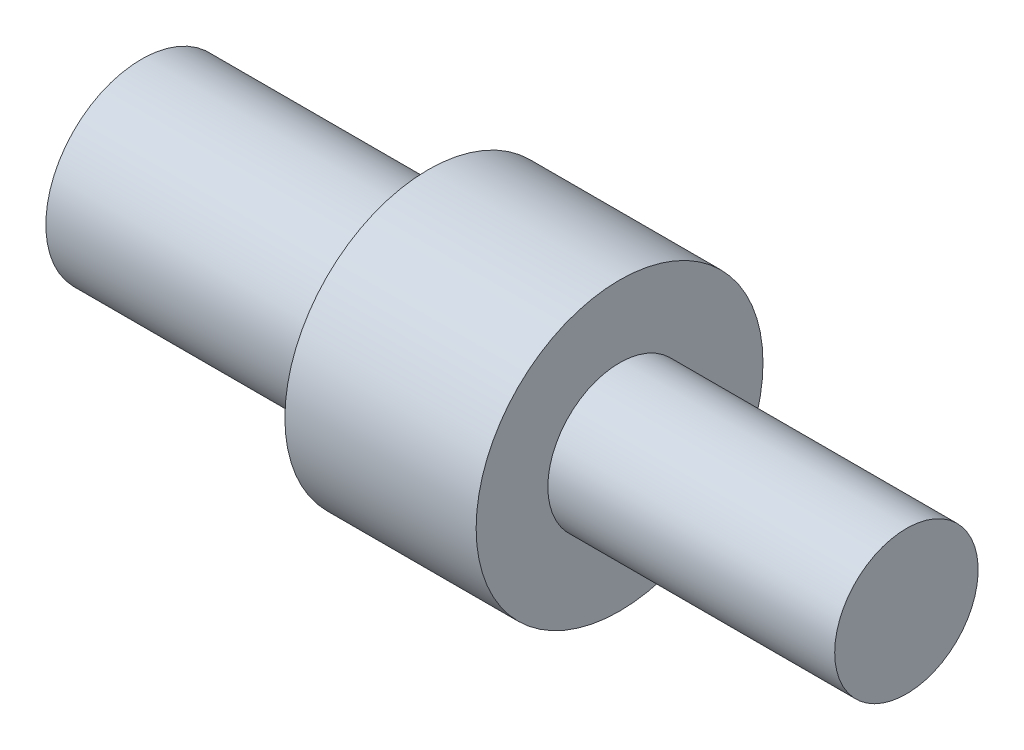
ISO-10303-21;
HEADER;
FILE_DESCRIPTION(('STEP AP214'),'2;1');
FILE_NAME('part.step','',(''),(''),'','','');
FILE_SCHEMA(('AUTOMOTIVE_DESIGN { 1 0 10303 214 1 1 1 1 }'));
ENDSEC;
DATA;
#1=APPLICATION_CONTEXT('core data for automotive mechanical design processes');
#2=APPLICATION_PROTOCOL_DEFINITION('international standard','automotive_design',2000,#1);
#3=PRODUCT_CONTEXT('',#1,'mechanical');
#4=PRODUCT('Part','Part','',(#3));
#5=PRODUCT_RELATED_PRODUCT_CATEGORY('part','',(#4));
#6=PRODUCT_DEFINITION_FORMATION('','',#4);
#7=PRODUCT_DEFINITION_CONTEXT('part definition',#1,'design');
#8=PRODUCT_DEFINITION('design','',#6,#7);
#9=PRODUCT_DEFINITION_SHAPE('','',#8);
#10=(LENGTH_UNIT() NAMED_UNIT(*) SI_UNIT(.MILLI.,.METRE.));
#11=(NAMED_UNIT(*) PLANE_ANGLE_UNIT() SI_UNIT($,.RADIAN.));
#12=(NAMED_UNIT(*) SI_UNIT($,.STERADIAN.) SOLID_ANGLE_UNIT());
#13=UNCERTAINTY_MEASURE_WITH_UNIT(LENGTH_MEASURE(1.E-05),#10,'distance_accuracy_value','');
#14=(GEOMETRIC_REPRESENTATION_CONTEXT(3) GLOBAL_UNCERTAINTY_ASSIGNED_CONTEXT((#13)) GLOBAL_UNIT_ASSIGNED_CONTEXT((#10,
#11,#12)) REPRESENTATION_CONTEXT('',''));
#15=CARTESIAN_POINT('',(0.,0.,0.));
#16=DIRECTION('',(0.,0.,1.));
#17=DIRECTION('',(1.,0.,0.));
#18=AXIS2_PLACEMENT_3D('',#15,#16,#17);
#19=CARTESIAN_POINT('',(-6.35,0.,0.));
#20=DIRECTION('',(1.,0.,0.));
#21=DIRECTION('',(0.,0.,-1.));
#22=AXIS2_PLACEMENT_3D('',#19,#20,#21);
#23=PLANE('',#22);
#24=CARTESIAN_POINT('',(-6.35,0.,0.));
#25=DIRECTION('',(1.,0.,0.));
#26=DIRECTION('',(0.,0.,-1.));
#27=AXIS2_PLACEMENT_3D('',#24,#25,#26);
#28=CIRCLE('',#27,9.525);
#29=CARTESIAN_POINT('',(-6.35,0.,-9.525));
#30=VERTEX_POINT('',#29);
#31=EDGE_CURVE('E40',#30,#30,#28,.T.);
#32=ORIENTED_EDGE('',*,*,#31,.F.);
#33=EDGE_LOOP('',(#32));
#34=FACE_BOUND('',#33,.T.);
#35=CARTESIAN_POINT('',(-6.35,0.,0.));
#36=DIRECTION('',(1.,0.,0.));
#37=DIRECTION('',(0.,0.,-1.));
#38=AXIS2_PLACEMENT_3D('',#35,#36,#37);
#39=CIRCLE('',#38,6.35);
#40=CARTESIAN_POINT('',(-6.35,0.,-6.35));
#41=VERTEX_POINT('',#40);
#42=EDGE_CURVE('E10',#41,#41,#39,.F.);
#43=ORIENTED_EDGE('',*,*,#42,.F.);
#44=EDGE_LOOP('',(#43));
#45=FACE_BOUND('',#44,.T.);
#46=ADVANCED_FACE('F29',(#34,#45),#23,.F.);
#47=CARTESIAN_POINT('',(6.35,0.,0.));
#48=DIRECTION('',(1.,0.,0.));
#49=DIRECTION('',(0.,0.,-1.));
#50=AXIS2_PLACEMENT_3D('',#47,#48,#49);
#51=PLANE('',#50);
#52=CARTESIAN_POINT('',(6.35,0.,0.));
#53=DIRECTION('',(1.,0.,0.));
#54=DIRECTION('',(0.,0.,-1.));
#55=AXIS2_PLACEMENT_3D('',#52,#53,#54);
#56=CIRCLE('',#55,9.525);
#57=CARTESIAN_POINT('',(6.35,0.,-9.525));
#58=VERTEX_POINT('',#57);
#59=EDGE_CURVE('E36',#58,#58,#56,.T.);
#60=ORIENTED_EDGE('',*,*,#59,.T.);
#61=EDGE_LOOP('',(#60));
#62=FACE_BOUND('',#61,.T.);
#63=CARTESIAN_POINT('',(6.35,0.,0.));
#64=DIRECTION('',(1.,0.,0.));
#65=DIRECTION('',(0.,0.,-1.));
#66=AXIS2_PLACEMENT_3D('',#63,#64,#65);
#67=CIRCLE('',#66,4.7625);
#68=CARTESIAN_POINT('',(6.35,0.,4.7625));
#69=VERTEX_POINT('',#68);
#70=EDGE_CURVE('E47',#69,#69,#67,.T.);
#71=ORIENTED_EDGE('',*,*,#70,.F.);
#72=EDGE_LOOP('',(#71));
#73=FACE_BOUND('',#72,.T.);
#74=ADVANCED_FACE('F71',(#62,#73),#51,.T.);
#75=CARTESIAN_POINT('',(6.35,0.,0.));
#76=DIRECTION('',(-1.,0.,0.));
#77=DIRECTION('',(0.,0.,1.));
#78=AXIS2_PLACEMENT_3D('',#75,#76,#77);
#79=CYLINDRICAL_SURFACE('',#78,9.525);
#80=ORIENTED_EDGE('',*,*,#59,.F.);
#81=EDGE_LOOP('',(#80));
#82=FACE_BOUND('',#81,.T.);
#83=ORIENTED_EDGE('',*,*,#31,.T.);
#84=EDGE_LOOP('',(#83));
#85=FACE_BOUND('',#84,.T.);
#86=ADVANCED_FACE('F31',(#82,#85),#79,.T.);
#87=CARTESIAN_POINT('',(25.4,0.,0.));
#88=DIRECTION('',(-1.,0.,0.));
#89=DIRECTION('',(0.,0.,1.));
#90=AXIS2_PLACEMENT_3D('',#87,#88,#89);
#91=CYLINDRICAL_SURFACE('',#90,4.7625);
#92=CARTESIAN_POINT('',(25.4,0.,0.));
#93=DIRECTION('',(1.,0.,0.));
#94=DIRECTION('',(0.,0.,-1.));
#95=AXIS2_PLACEMENT_3D('',#92,#93,#94);
#96=CIRCLE('',#95,4.7625);
#97=CARTESIAN_POINT('',(25.4,0.,4.7625));
#98=VERTEX_POINT('',#97);
#99=EDGE_CURVE('E45',#98,#98,#96,.T.);
#100=CARTESIAN_POINT('',(25.4,0.,4.7625));
#101=CARTESIAN_POINT('',(25.2015625,0.,4.7625));
#102=CARTESIAN_POINT('',(25.003125,0.,4.7625));
#103=CARTESIAN_POINT('',(24.60625,0.,4.7625));
#104=CARTESIAN_POINT('',(24.4078125,0.,4.7625));
#105=CARTESIAN_POINT('',(24.0109375,0.,4.7625));
#106=CARTESIAN_POINT('',(23.8125,0.,4.7625));
#107=CARTESIAN_POINT('',(23.415625,0.,4.7625));
#108=CARTESIAN_POINT('',(23.2171875,0.,4.7625));
#109=CARTESIAN_POINT('',(22.8203125,0.,4.7625));
#110=CARTESIAN_POINT('',(22.621875,0.,4.7625));
#111=CARTESIAN_POINT('',(22.225,0.,4.7625));
#112=CARTESIAN_POINT('',(22.0265625,0.,4.7625));
#113=CARTESIAN_POINT('',(21.6296875,0.,4.7625));
#114=CARTESIAN_POINT('',(21.43125,0.,4.7625));
#115=CARTESIAN_POINT('',(21.034375,0.,4.7625));
#116=CARTESIAN_POINT('',(20.8359375,0.,4.7625));
#117=CARTESIAN_POINT('',(20.4390625,0.,4.7625));
#118=CARTESIAN_POINT('',(20.240625,0.,4.7625));
#119=CARTESIAN_POINT('',(19.84375,0.,4.7625));
#120=CARTESIAN_POINT('',(19.6453125,0.,4.7625));
#121=CARTESIAN_POINT('',(19.2484375,0.,4.7625));
#122=CARTESIAN_POINT('',(19.05,0.,4.7625));
#123=CARTESIAN_POINT('',(18.653125,0.,4.7625));
#124=CARTESIAN_POINT('',(18.4546875,0.,4.7625));
#125=CARTESIAN_POINT('',(18.0578125,0.,4.7625));
#126=CARTESIAN_POINT('',(17.859375,0.,4.7625));
#127=CARTESIAN_POINT('',(17.4625,0.,4.7625));
#128=CARTESIAN_POINT('',(17.2640625,0.,4.7625));
#129=CARTESIAN_POINT('',(16.8671875,0.,4.7625));
#130=CARTESIAN_POINT('',(16.66875,0.,4.7625));
#131=CARTESIAN_POINT('',(16.271875,0.,4.7625));
#132=CARTESIAN_POINT('',(16.0734375,0.,4.7625));
#133=CARTESIAN_POINT('',(15.6765625,0.,4.7625));
#134=CARTESIAN_POINT('',(15.478125,0.,4.7625));
#135=CARTESIAN_POINT('',(15.08125,0.,4.7625));
#136=CARTESIAN_POINT('',(14.8828125,0.,4.7625));
#137=CARTESIAN_POINT('',(14.4859375,0.,4.7625));
#138=CARTESIAN_POINT('',(14.2875,0.,4.7625));
#139=CARTESIAN_POINT('',(13.890625,0.,4.7625));
#140=CARTESIAN_POINT('',(13.6921875,0.,4.7625));
#141=CARTESIAN_POINT('',(13.2953125,0.,4.7625));
#142=CARTESIAN_POINT('',(13.096875,0.,4.7625));
#143=CARTESIAN_POINT('',(12.7,0.,4.7625));
#144=CARTESIAN_POINT('',(12.5015625,0.,4.7625));
#145=CARTESIAN_POINT('',(12.1046875,0.,4.7625));
#146=CARTESIAN_POINT('',(11.90625,0.,4.7625));
#147=CARTESIAN_POINT('',(11.509375,0.,4.7625));
#148=CARTESIAN_POINT('',(11.3109375,0.,4.7625));
#149=CARTESIAN_POINT('',(10.9140625,0.,4.7625));
#150=CARTESIAN_POINT('',(10.715625,0.,4.7625));
#151=CARTESIAN_POINT('',(10.31875,0.,4.7625));
#152=CARTESIAN_POINT('',(10.1203125,0.,4.7625));
#153=CARTESIAN_POINT('',(9.7234375,0.,4.7625));
#154=CARTESIAN_POINT('',(9.525,0.,4.7625));
#155=CARTESIAN_POINT('',(9.128125,0.,4.7625));
#156=CARTESIAN_POINT('',(8.9296875,0.,4.7625));
#157=CARTESIAN_POINT('',(8.5328125,0.,4.7625));
#158=CARTESIAN_POINT('',(8.334375,0.,4.7625));
#159=CARTESIAN_POINT('',(7.9375,0.,4.7625));
#160=CARTESIAN_POINT('',(7.7390625,0.,4.7625));
#161=CARTESIAN_POINT('',(7.3421875,0.,4.7625));
#162=CARTESIAN_POINT('',(7.14375,0.,4.7625));
#163=CARTESIAN_POINT('',(6.746875,0.,4.7625));
#164=CARTESIAN_POINT('',(6.5484375,0.,4.7625));
#165=CARTESIAN_POINT('',(6.35,0.,4.7625));
#166=B_SPLINE_CURVE_WITH_KNOTS('',3,(#100,#101,#102,#103,#104,#105,#106,#107,#108,#109,#110,
#111,#112,#113,#114,#115,#116,#117,#118,#119,#120,#121,#122,#123,#124,#125,#126,#127,#128,#129,
#130,#131,#132,#133,#134,#135,#136,#137,#138,#139,#140,#141,#142,#143,#144,#145,#146,#147,#148,
#149,#150,#151,#152,#153,#154,#155,#156,#157,#158,#159,#160,#161,#162,#163,#164,#165),
.UNSPECIFIED.,.F.,.F.,(4,2,2,2,2,2,2,2,2,2,2,2,2,2,2,2,2,2,2,2,2,2,2,2,2,2,2,2,2,2,2,2,4),(0.,
0.5953125,1.190625,1.7859375,2.38125,2.9765625,3.571875,4.1671875,4.7625,5.3578125,5.953125,
6.5484375,7.14375,7.7390625,8.334375,8.9296875,9.525,10.1203125,10.715625,11.3109375,11.90625,
12.5015625,13.096875,13.6921875,14.2875,14.8828125,15.478125,16.0734375,16.66875,17.2640625,
17.859375,18.4546875,19.05),.UNSPECIFIED.);
#167=EDGE_CURVE('BSEAM67',#98,#69,#166,.T.);
#168=ORIENTED_EDGE('',*,*,#99,.F.);
#169=ORIENTED_EDGE('',*,*,#70,.T.);
#170=ORIENTED_EDGE('',*,*,#167,.T.);
#171=ORIENTED_EDGE('',*,*,#167,.F.);
#172=EDGE_LOOP('',(#168,#170,#169,#171));
#173=FACE_BOUND('',#172,.T.);
#174=ADVANCED_FACE('F67',(#173),#91,.T.);
#175=CARTESIAN_POINT('',(25.4,0.,0.));
#176=DIRECTION('',(1.,0.,0.));
#177=DIRECTION('',(0.,0.,-1.));
#178=AXIS2_PLACEMENT_3D('',#175,#176,#177);
#179=PLANE('',#178);
#180=ORIENTED_EDGE('',*,*,#99,.T.);
#181=EDGE_LOOP('',(#180));
#182=FACE_BOUND('',#181,.T.);
#183=ADVANCED_FACE('F60',(#182),#179,.T.);
#184=CARTESIAN_POINT('',(-25.4,0.,0.));
#185=DIRECTION('',(1.,0.,0.));
#186=DIRECTION('',(0.,0.,-1.));
#187=AXIS2_PLACEMENT_3D('',#184,#185,#186);
#188=CYLINDRICAL_SURFACE('',#187,6.35);
#189=CARTESIAN_POINT('',(-25.4,0.,0.));
#190=DIRECTION('',(-1.,0.,0.));
#191=DIRECTION('',(0.,0.,1.));
#192=AXIS2_PLACEMENT_3D('',#189,#190,#191);
#193=CIRCLE('',#192,6.35);
#194=CARTESIAN_POINT('',(-25.4,0.,-6.35));
#195=VERTEX_POINT('',#194);
#196=EDGE_CURVE('E50',#195,#195,#193,.T.);
#197=CARTESIAN_POINT('',(-25.4,0.,-6.35));
#198=CARTESIAN_POINT('',(-25.2015625,0.,-6.35));
#199=CARTESIAN_POINT('',(-25.003125,0.,-6.35));
#200=CARTESIAN_POINT('',(-24.60625,0.,-6.35));
#201=CARTESIAN_POINT('',(-24.4078125,0.,-6.35));
#202=CARTESIAN_POINT('',(-24.0109375,0.,-6.35));
#203=CARTESIAN_POINT('',(-23.8125,0.,-6.35));
#204=CARTESIAN_POINT('',(-23.415625,0.,-6.35));
#205=CARTESIAN_POINT('',(-23.2171875,0.,-6.35));
#206=CARTESIAN_POINT('',(-22.8203125,0.,-6.35));
#207=CARTESIAN_POINT('',(-22.621875,0.,-6.35));
#208=CARTESIAN_POINT('',(-22.225,0.,-6.35));
#209=CARTESIAN_POINT('',(-22.0265625,0.,-6.35));
#210=CARTESIAN_POINT('',(-21.6296875,0.,-6.35));
#211=CARTESIAN_POINT('',(-21.43125,0.,-6.35));
#212=CARTESIAN_POINT('',(-21.034375,0.,-6.35));
#213=CARTESIAN_POINT('',(-20.8359375,0.,-6.35));
#214=CARTESIAN_POINT('',(-20.4390625,0.,-6.35));
#215=CARTESIAN_POINT('',(-20.240625,0.,-6.35));
#216=CARTESIAN_POINT('',(-19.84375,0.,-6.35));
#217=CARTESIAN_POINT('',(-19.6453125,0.,-6.35));
#218=CARTESIAN_POINT('',(-19.2484375,0.,-6.35));
#219=CARTESIAN_POINT('',(-19.05,0.,-6.35));
#220=CARTESIAN_POINT('',(-18.653125,0.,-6.35));
#221=CARTESIAN_POINT('',(-18.4546875,0.,-6.35));
#222=CARTESIAN_POINT('',(-18.0578125,0.,-6.35));
#223=CARTESIAN_POINT('',(-17.859375,0.,-6.35));
#224=CARTESIAN_POINT('',(-17.4625,0.,-6.35));
#225=CARTESIAN_POINT('',(-17.2640625,0.,-6.35));
#226=CARTESIAN_POINT('',(-16.8671875,0.,-6.35));
#227=CARTESIAN_POINT('',(-16.66875,0.,-6.35));
#228=CARTESIAN_POINT('',(-16.271875,0.,-6.35));
#229=CARTESIAN_POINT('',(-16.0734375,0.,-6.35));
#230=CARTESIAN_POINT('',(-15.6765625,0.,-6.35));
#231=CARTESIAN_POINT('',(-15.478125,0.,-6.35));
#232=CARTESIAN_POINT('',(-15.08125,0.,-6.35));
#233=CARTESIAN_POINT('',(-14.8828125,0.,-6.35));
#234=CARTESIAN_POINT('',(-14.4859375,0.,-6.35));
#235=CARTESIAN_POINT('',(-14.2875,0.,-6.35));
#236=CARTESIAN_POINT('',(-13.890625,0.,-6.35));
#237=CARTESIAN_POINT('',(-13.6921875,0.,-6.35));
#238=CARTESIAN_POINT('',(-13.2953125,0.,-6.35));
#239=CARTESIAN_POINT('',(-13.096875,0.,-6.35));
#240=CARTESIAN_POINT('',(-12.7,0.,-6.35));
#241=CARTESIAN_POINT('',(-12.5015625,0.,-6.35));
#242=CARTESIAN_POINT('',(-12.1046875,0.,-6.35));
#243=CARTESIAN_POINT('',(-11.90625,0.,-6.35));
#244=CARTESIAN_POINT('',(-11.509375,0.,-6.35));
#245=CARTESIAN_POINT('',(-11.3109375,0.,-6.35));
#246=CARTESIAN_POINT('',(-10.9140625,0.,-6.35));
#247=CARTESIAN_POINT('',(-10.715625,0.,-6.35));
#248=CARTESIAN_POINT('',(-10.31875,0.,-6.35));
#249=CARTESIAN_POINT('',(-10.1203125,0.,-6.35));
#250=CARTESIAN_POINT('',(-9.7234375,0.,-6.35));
#251=CARTESIAN_POINT('',(-9.525,0.,-6.35));
#252=CARTESIAN_POINT('',(-9.128125,0.,-6.35));
#253=CARTESIAN_POINT('',(-8.92968750000001,0.,-6.35));
#254=CARTESIAN_POINT('',(-8.53281250000001,0.,-6.35));
#255=CARTESIAN_POINT('',(-8.33437500000001,0.,-6.35));
#256=CARTESIAN_POINT('',(-7.93750000000001,0.,-6.35));
#257=CARTESIAN_POINT('',(-7.73906250000001,0.,-6.35));
#258=CARTESIAN_POINT('',(-7.34218750000001,0.,-6.35));
#259=CARTESIAN_POINT('',(-7.14375000000001,0.,-6.35));
#260=CARTESIAN_POINT('',(-6.74687500000001,0.,-6.35));
#261=CARTESIAN_POINT('',(-6.5484375,0.,-6.35));
#262=CARTESIAN_POINT('',(-6.35,0.,-6.35));
#263=B_SPLINE_CURVE_WITH_KNOTS('',3,(#197,#198,#199,#200,#201,#202,#203,#204,#205,#206,#207,
#208,#209,#210,#211,#212,#213,#214,#215,#216,#217,#218,#219,#220,#221,#222,#223,#224,#225,#226,
#227,#228,#229,#230,#231,#232,#233,#234,#235,#236,#237,#238,#239,#240,#241,#242,#243,#244,#245,
#246,#247,#248,#249,#250,#251,#252,#253,#254,#255,#256,#257,#258,#259,#260,#261,#262),
.UNSPECIFIED.,.F.,.F.,(4,2,2,2,2,2,2,2,2,2,2,2,2,2,2,2,2,2,2,2,2,2,2,2,2,2,2,2,2,2,2,2,4),(0.,
0.5953125,1.190625,1.7859375,2.38125,2.9765625,3.571875,4.1671875,4.7625,5.3578125,5.953125,
6.5484375,7.14375,7.7390625,8.334375,8.9296875,9.525,10.1203125,10.715625,11.3109375,11.90625,
12.5015625,13.096875,13.6921875,14.2875,14.8828125,15.478125,16.0734375,16.66875,17.2640625,
17.859375,18.4546875,19.05),.UNSPECIFIED.);
#264=EDGE_CURVE('BSEAM58',#195,#41,#263,.T.);
#265=ORIENTED_EDGE('',*,*,#196,.F.);
#266=ORIENTED_EDGE('',*,*,#42,.T.);
#267=ORIENTED_EDGE('',*,*,#264,.T.);
#268=ORIENTED_EDGE('',*,*,#264,.F.);
#269=EDGE_LOOP('',(#265,#267,#266,#268));
#270=FACE_BOUND('',#269,.T.);
#271=ADVANCED_FACE('F58',(#270),#188,.T.);
#272=CARTESIAN_POINT('',(-25.4,0.,0.));
#273=DIRECTION('',(-1.,0.,0.));
#274=DIRECTION('',(0.,0.,1.));
#275=AXIS2_PLACEMENT_3D('',#272,#273,#274);
#276=PLANE('',#275);
#277=ORIENTED_EDGE('',*,*,#196,.T.);
#278=EDGE_LOOP('',(#277));
#279=FACE_BOUND('',#278,.T.);
#280=ADVANCED_FACE('F56',(#279),#276,.T.);
#281=CLOSED_SHELL('',(#46,#74,#86,#174,#183,#271,#280));
#282=MANIFOLD_SOLID_BREP('B2',#281);
#283=ADVANCED_BREP_SHAPE_REPRESENTATION('',(#18,#282),#14);
#284=SHAPE_DEFINITION_REPRESENTATION(#9,#283);
ENDSEC;
END-ISO-10303-21;
